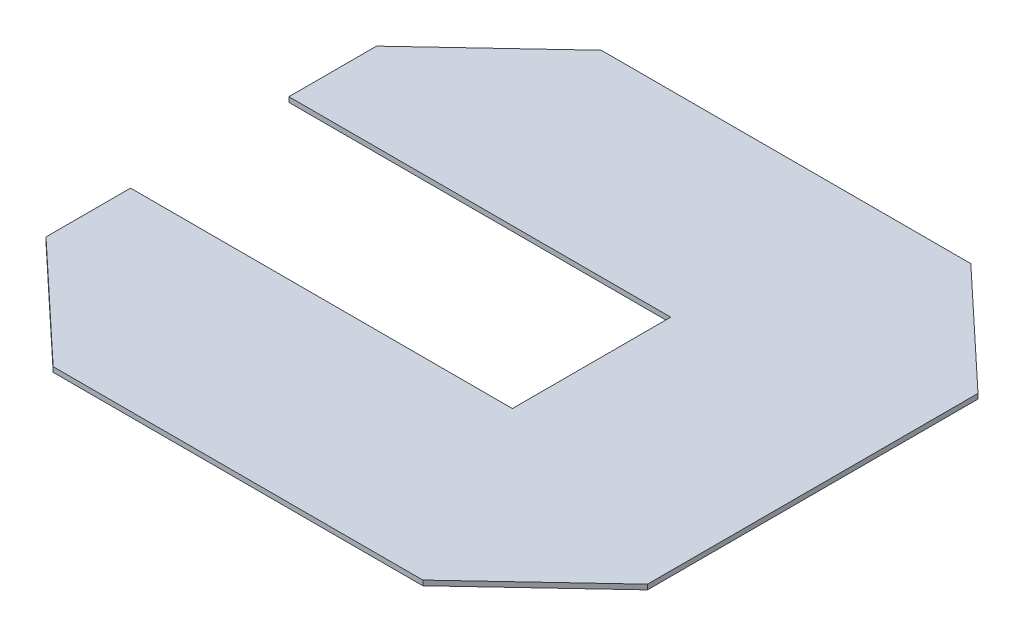
ISO-10303-21;
HEADER;
FILE_DESCRIPTION(('STEP AP214'),'2;1');
FILE_NAME('part.step','',(''),(''),'','','');
FILE_SCHEMA(('AUTOMOTIVE_DESIGN { 1 0 10303 214 1 1 1 1 }'));
ENDSEC;
DATA;
#1=APPLICATION_CONTEXT('core data for automotive mechanical design processes');
#2=APPLICATION_PROTOCOL_DEFINITION('international standard','automotive_design',2000,#1);
#3=PRODUCT_CONTEXT('',#1,'mechanical');
#4=PRODUCT('Part','Part','',(#3));
#5=PRODUCT_RELATED_PRODUCT_CATEGORY('part','',(#4));
#6=PRODUCT_DEFINITION_FORMATION('','',#4);
#7=PRODUCT_DEFINITION_CONTEXT('part definition',#1,'design');
#8=PRODUCT_DEFINITION('design','',#6,#7);
#9=PRODUCT_DEFINITION_SHAPE('','',#8);
#10=(LENGTH_UNIT() NAMED_UNIT(*) SI_UNIT(.MILLI.,.METRE.));
#11=(NAMED_UNIT(*) PLANE_ANGLE_UNIT() SI_UNIT($,.RADIAN.));
#12=(NAMED_UNIT(*) SI_UNIT($,.STERADIAN.) SOLID_ANGLE_UNIT());
#13=UNCERTAINTY_MEASURE_WITH_UNIT(LENGTH_MEASURE(1.E-05),#10,'distance_accuracy_value','');
#14=(GEOMETRIC_REPRESENTATION_CONTEXT(3) GLOBAL_UNCERTAINTY_ASSIGNED_CONTEXT((#13)) GLOBAL_UNIT_ASSIGNED_CONTEXT((#10,
#11,#12)) REPRESENTATION_CONTEXT('',''));
#15=CARTESIAN_POINT('',(0.,0.,0.));
#16=DIRECTION('',(0.,0.,1.));
#17=DIRECTION('',(1.,0.,0.));
#18=AXIS2_PLACEMENT_3D('',#15,#16,#17);
#19=CARTESIAN_POINT('',(151.062501167287,2.5,-84.3656451515783));
#20=DIRECTION('',(-1.,0.,0.));
#21=DIRECTION('',(0.,0.,1.));
#22=AXIS2_PLACEMENT_3D('',#19,#20,#21);
#23=PLANE('',#22);
#24=DIRECTION('',(0.,0.,-1.));
#25=VECTOR('',#24,1.);
#26=CARTESIAN_POINT('',(151.062501167287,0.,-84.3656451515783));
#27=LINE('',#26,#25);
#28=CARTESIAN_POINT('',(151.062501167287,0.,82.7522675664535));
#29=VERTEX_POINT('',#28);
#30=CARTESIAN_POINT('',(151.062501167287,0.,-84.3656451515783));
#31=VERTEX_POINT('',#30);
#32=EDGE_CURVE('E151',#29,#31,#27,.T.);
#33=ORIENTED_EDGE('',*,*,#32,.T.);
#34=DIRECTION('',(0.,-1.,0.));
#35=VECTOR('',#34,1.);
#36=CARTESIAN_POINT('',(151.062501167287,2.5,-84.3656451515783));
#37=LINE('',#36,#35);
#38=CARTESIAN_POINT('',(151.062501167287,2.5,-84.3656451515783));
#39=VERTEX_POINT('',#38);
#40=EDGE_CURVE('E11',#39,#31,#37,.T.);
#41=ORIENTED_EDGE('',*,*,#40,.F.);
#42=DIRECTION('',(0.,0.,-1.));
#43=VECTOR('',#42,1.);
#44=CARTESIAN_POINT('',(151.062501167287,2.5,-84.3656451515783));
#45=LINE('',#44,#43);
#46=CARTESIAN_POINT('',(151.062501167287,2.5,82.7522675664535));
#47=VERTEX_POINT('',#46);
#48=EDGE_CURVE('E173',#47,#39,#45,.T.);
#49=ORIENTED_EDGE('',*,*,#48,.F.);
#50=DIRECTION('',(0.,-1.,0.));
#51=VECTOR('',#50,1.);
#52=CARTESIAN_POINT('',(151.062501167287,2.5,82.7522675664535));
#53=LINE('',#52,#51);
#54=EDGE_CURVE('E147',#47,#29,#53,.T.);
#55=ORIENTED_EDGE('',*,*,#54,.T.);
#56=EDGE_LOOP('',(#33,#41,#49,#55));
#57=FACE_BOUND('',#56,.T.);
#58=ADVANCED_FACE('F31',(#57),#23,.F.);
#59=CARTESIAN_POINT('',(151.062501167287,2.5,-84.3656451515783));
#60=DIRECTION('',(-0.684162569970035,0.,0.729329539955703));
#61=DIRECTION('',(0.729329539955703,0.,0.684162569970035));
#62=AXIS2_PLACEMENT_3D('',#59,#60,#61);
#63=PLANE('',#62);
#64=DIRECTION('',(-0.729329539955703,0.,-0.684162569970035));
#65=VECTOR('',#64,1.);
#66=CARTESIAN_POINT('',(151.062501167287,0.,-84.3656451515783));
#67=LINE('',#66,#65);
#68=CARTESIAN_POINT('',(92.4315171610729,0.,-139.365645151578));
#69=VERTEX_POINT('',#68);
#70=EDGE_CURVE('E154',#31,#69,#67,.T.);
#71=ORIENTED_EDGE('',*,*,#70,.T.);
#72=DIRECTION('',(0.,-1.,0.));
#73=VECTOR('',#72,1.);
#74=CARTESIAN_POINT('',(92.4315171610729,2.5,-139.365645151578));
#75=LINE('',#74,#73);
#76=CARTESIAN_POINT('',(92.4315171610729,2.5,-139.365645151578));
#77=VERTEX_POINT('',#76);
#78=EDGE_CURVE('E39',#77,#69,#75,.T.);
#79=ORIENTED_EDGE('',*,*,#78,.F.);
#80=DIRECTION('',(-0.729329539955703,0.,-0.684162569970035));
#81=VECTOR('',#80,1.);
#82=CARTESIAN_POINT('',(151.062501167287,2.5,-84.3656451515783));
#83=LINE('',#82,#81);
#84=EDGE_CURVE('E102',#39,#77,#83,.T.);
#85=ORIENTED_EDGE('',*,*,#84,.F.);
#86=ORIENTED_EDGE('',*,*,#40,.T.);
#87=EDGE_LOOP('',(#71,#79,#85,#86));
#88=FACE_BOUND('',#87,.T.);
#89=ADVANCED_FACE('F251',(#88),#63,.F.);
#90=CARTESIAN_POINT('',(-94.4415080405909,2.5,-139.365645151578));
#91=DIRECTION('',(0.,0.,1.));
#92=DIRECTION('',(1.,0.,0.));
#93=AXIS2_PLACEMENT_3D('',#90,#91,#92);
#94=PLANE('',#93);
#95=DIRECTION('',(-1.,0.,0.));
#96=VECTOR('',#95,1.);
#97=CARTESIAN_POINT('',(-94.4415080405909,0.,-139.365645151578));
#98=LINE('',#97,#96);
#99=CARTESIAN_POINT('',(-94.4415080405909,0.,-139.365645151578));
#100=VERTEX_POINT('',#99);
#101=EDGE_CURVE('E156',#69,#100,#98,.T.);
#102=ORIENTED_EDGE('',*,*,#101,.T.);
#103=DIRECTION('',(0.,-1.,0.));
#104=VECTOR('',#103,1.);
#105=CARTESIAN_POINT('',(-94.4415080405909,2.5,-139.365645151578));
#106=LINE('',#105,#104);
#107=CARTESIAN_POINT('',(-94.4415080405909,2.5,-139.365645151578));
#108=VERTEX_POINT('',#107);
#109=EDGE_CURVE('E192',#108,#100,#106,.T.);
#110=ORIENTED_EDGE('',*,*,#109,.F.);
#111=DIRECTION('',(-1.,0.,0.));
#112=VECTOR('',#111,1.);
#113=CARTESIAN_POINT('',(-94.4415080405909,2.5,-139.365645151578));
#114=LINE('',#113,#112);
#115=EDGE_CURVE('E200',#77,#108,#114,.T.);
#116=ORIENTED_EDGE('',*,*,#115,.F.);
#117=ORIENTED_EDGE('',*,*,#78,.T.);
#118=EDGE_LOOP('',(#102,#110,#116,#117));
#119=FACE_BOUND('',#118,.T.);
#120=ADVANCED_FACE('F198',(#119),#94,.F.);
#121=CARTESIAN_POINT('',(-153.072492046805,2.5,-84.3656451515783));
#122=DIRECTION('',(0.684162569970035,0.,0.729329539955703));
#123=DIRECTION('',(0.729329539955703,0.,-0.684162569970035));
#124=AXIS2_PLACEMENT_3D('',#121,#122,#123);
#125=PLANE('',#124);
#126=DIRECTION('',(-0.729329539955703,0.,0.684162569970035));
#127=VECTOR('',#126,1.);
#128=CARTESIAN_POINT('',(-153.072492046805,0.,-84.3656451515783));
#129=LINE('',#128,#127);
#130=CARTESIAN_POINT('',(-153.072492046805,0.,-84.3656451515783));
#131=VERTEX_POINT('',#130);
#132=EDGE_CURVE('E158',#100,#131,#129,.T.);
#133=ORIENTED_EDGE('',*,*,#132,.T.);
#134=DIRECTION('',(0.,-1.,0.));
#135=VECTOR('',#134,1.);
#136=CARTESIAN_POINT('',(-153.072492046805,2.5,-84.3656451515783));
#137=LINE('',#136,#135);
#138=CARTESIAN_POINT('',(-153.072492046805,2.5,-84.3656451515783));
#139=VERTEX_POINT('',#138);
#140=EDGE_CURVE('E189',#139,#131,#137,.T.);
#141=ORIENTED_EDGE('',*,*,#140,.F.);
#142=DIRECTION('',(-0.729329539955703,0.,0.684162569970035));
#143=VECTOR('',#142,1.);
#144=CARTESIAN_POINT('',(-153.072492046805,2.5,-84.3656451515783));
#145=LINE('',#144,#143);
#146=EDGE_CURVE('E218',#108,#139,#145,.T.);
#147=ORIENTED_EDGE('',*,*,#146,.F.);
#148=ORIENTED_EDGE('',*,*,#109,.T.);
#149=EDGE_LOOP('',(#133,#141,#147,#148));
#150=FACE_BOUND('',#149,.T.);
#151=ADVANCED_FACE('F209',(#150),#125,.F.);
#152=CARTESIAN_POINT('',(-153.072492046805,2.5,-84.3656451515783));
#153=DIRECTION('',(1.,0.,0.));
#154=DIRECTION('',(0.,0.,-1.));
#155=AXIS2_PLACEMENT_3D('',#152,#153,#154);
#156=PLANE('',#155);
#157=DIRECTION('',(0.,0.,1.));
#158=VECTOR('',#157,1.);
#159=CARTESIAN_POINT('',(-153.072492046805,0.,-84.3656451515783));
#160=LINE('',#159,#158);
#161=CARTESIAN_POINT('',(-153.072492046805,0.,-40.0618137816611));
#162=VERTEX_POINT('',#161);
#163=EDGE_CURVE('E160',#131,#162,#160,.T.);
#164=ORIENTED_EDGE('',*,*,#163,.T.);
#165=DIRECTION('',(0.,-1.,0.));
#166=VECTOR('',#165,1.);
#167=CARTESIAN_POINT('',(-153.072492046805,2.5,-40.0618137816611));
#168=LINE('',#167,#166);
#169=CARTESIAN_POINT('',(-153.072492046805,2.5,-40.0618137816611));
#170=VERTEX_POINT('',#169);
#171=EDGE_CURVE('E186',#170,#162,#168,.T.);
#172=ORIENTED_EDGE('',*,*,#171,.F.);
#173=DIRECTION('',(0.,0.,1.));
#174=VECTOR('',#173,1.);
#175=CARTESIAN_POINT('',(-153.072492046805,2.5,-84.3656451515783));
#176=LINE('',#175,#174);
#177=EDGE_CURVE('E215',#139,#170,#176,.T.);
#178=ORIENTED_EDGE('',*,*,#177,.F.);
#179=ORIENTED_EDGE('',*,*,#140,.T.);
#180=EDGE_LOOP('',(#164,#172,#178,#179));
#181=FACE_BOUND('',#180,.T.);
#182=ADVANCED_FACE('F213',(#181),#156,.F.);
#183=CARTESIAN_POINT('',(-153.072492046805,2.5,-40.0618137816611));
#184=DIRECTION('',(0.,0.,-1.));
#185=DIRECTION('',(-1.,0.,0.));
#186=AXIS2_PLACEMENT_3D('',#183,#184,#185);
#187=PLANE('',#186);
#188=DIRECTION('',(1.,0.,0.));
#189=VECTOR('',#188,1.);
#190=CARTESIAN_POINT('',(-153.072492046805,0.,-40.0618137816611));
#191=LINE('',#190,#189);
#192=CARTESIAN_POINT('',(40.,0.,-40.0618137816611));
#193=VERTEX_POINT('',#192);
#194=EDGE_CURVE('E162',#162,#193,#191,.T.);
#195=ORIENTED_EDGE('',*,*,#194,.T.);
#196=DIRECTION('',(0.,-1.,0.));
#197=VECTOR('',#196,1.);
#198=CARTESIAN_POINT('',(40.,2.5,-40.0618137816611));
#199=LINE('',#198,#197);
#200=CARTESIAN_POINT('',(40.,2.5,-40.0618137816611));
#201=VERTEX_POINT('',#200);
#202=EDGE_CURVE('E183',#201,#193,#199,.T.);
#203=ORIENTED_EDGE('',*,*,#202,.F.);
#204=DIRECTION('',(1.,0.,0.));
#205=VECTOR('',#204,1.);
#206=CARTESIAN_POINT('',(-153.072492046805,2.5,-40.0618137816611));
#207=LINE('',#206,#205);
#208=EDGE_CURVE('E217',#170,#201,#207,.T.);
#209=ORIENTED_EDGE('',*,*,#208,.F.);
#210=ORIENTED_EDGE('',*,*,#171,.T.);
#211=EDGE_LOOP('',(#195,#203,#209,#210));
#212=FACE_BOUND('',#211,.T.);
#213=ADVANCED_FACE('F264',(#212),#187,.F.);
#214=CARTESIAN_POINT('',(40.,2.5,-40.0618137816611));
#215=DIRECTION('',(1.,0.,0.));
#216=DIRECTION('',(0.,0.,-1.));
#217=AXIS2_PLACEMENT_3D('',#214,#215,#216);
#218=PLANE('',#217);
#219=DIRECTION('',(0.,0.,1.));
#220=VECTOR('',#219,1.);
#221=CARTESIAN_POINT('',(40.,0.,-40.0618137816611));
#222=LINE('',#221,#220);
#223=CARTESIAN_POINT('',(40.,0.,40.));
#224=VERTEX_POINT('',#223);
#225=EDGE_CURVE('E164',#193,#224,#222,.T.);
#226=ORIENTED_EDGE('',*,*,#225,.T.);
#227=DIRECTION('',(0.,-1.,0.));
#228=VECTOR('',#227,1.);
#229=CARTESIAN_POINT('',(40.,2.5,40.));
#230=LINE('',#229,#228);
#231=CARTESIAN_POINT('',(40.,2.5,40.));
#232=VERTEX_POINT('',#231);
#233=EDGE_CURVE('E180',#232,#224,#230,.T.);
#234=ORIENTED_EDGE('',*,*,#233,.F.);
#235=DIRECTION('',(0.,0.,1.));
#236=VECTOR('',#235,1.);
#237=CARTESIAN_POINT('',(40.,2.5,-40.0618137816611));
#238=LINE('',#237,#236);
#239=EDGE_CURVE('E220',#201,#232,#238,.T.);
#240=ORIENTED_EDGE('',*,*,#239,.F.);
#241=ORIENTED_EDGE('',*,*,#202,.T.);
#242=EDGE_LOOP('',(#226,#234,#240,#241));
#243=FACE_BOUND('',#242,.T.);
#244=ADVANCED_FACE('F267',(#243),#218,.F.);
#245=CARTESIAN_POINT('',(-153.072492046805,2.5,40.));
#246=DIRECTION('',(0.,0.,1.));
#247=DIRECTION('',(1.,0.,0.));
#248=AXIS2_PLACEMENT_3D('',#245,#246,#247);
#249=PLANE('',#248);
#250=DIRECTION('',(-1.,0.,0.));
#251=VECTOR('',#250,1.);
#252=CARTESIAN_POINT('',(-153.072492046805,0.,40.));
#253=LINE('',#252,#251);
#254=CARTESIAN_POINT('',(-153.072492046805,0.,40.));
#255=VERTEX_POINT('',#254);
#256=EDGE_CURVE('E166',#224,#255,#253,.T.);
#257=ORIENTED_EDGE('',*,*,#256,.T.);
#258=DIRECTION('',(0.,-1.,0.));
#259=VECTOR('',#258,1.);
#260=CARTESIAN_POINT('',(-153.072492046805,2.5,40.));
#261=LINE('',#260,#259);
#262=CARTESIAN_POINT('',(-153.072492046805,2.5,40.));
#263=VERTEX_POINT('',#262);
#264=EDGE_CURVE('E177',#263,#255,#261,.T.);
#265=ORIENTED_EDGE('',*,*,#264,.F.);
#266=DIRECTION('',(-1.,0.,0.));
#267=VECTOR('',#266,1.);
#268=CARTESIAN_POINT('',(-153.072492046805,2.5,40.));
#269=LINE('',#268,#267);
#270=EDGE_CURVE('E226',#232,#263,#269,.T.);
#271=ORIENTED_EDGE('',*,*,#270,.F.);
#272=ORIENTED_EDGE('',*,*,#233,.T.);
#273=EDGE_LOOP('',(#257,#265,#271,#272));
#274=FACE_BOUND('',#273,.T.);
#275=ADVANCED_FACE('F232',(#274),#249,.F.);
#276=CARTESIAN_POINT('',(-153.072492046805,2.5,40.));
#277=DIRECTION('',(1.,0.,0.));
#278=DIRECTION('',(0.,0.,-1.));
#279=AXIS2_PLACEMENT_3D('',#276,#277,#278);
#280=PLANE('',#279);
#281=DIRECTION('',(0.,0.,1.));
#282=VECTOR('',#281,1.);
#283=CARTESIAN_POINT('',(-153.072492046805,0.,40.));
#284=LINE('',#283,#282);
#285=CARTESIAN_POINT('',(-153.072492046805,0.,82.7522675664535));
#286=VERTEX_POINT('',#285);
#287=EDGE_CURVE('E168',#255,#286,#284,.T.);
#288=ORIENTED_EDGE('',*,*,#287,.T.);
#289=DIRECTION('',(0.,-1.,0.));
#290=VECTOR('',#289,1.);
#291=CARTESIAN_POINT('',(-153.072492046805,2.5,82.7522675664535));
#292=LINE('',#291,#290);
#293=CARTESIAN_POINT('',(-153.072492046805,2.5,82.7522675664535));
#294=VERTEX_POINT('',#293);
#295=EDGE_CURVE('E142',#294,#286,#292,.T.);
#296=ORIENTED_EDGE('',*,*,#295,.F.);
#297=DIRECTION('',(0.,0.,1.));
#298=VECTOR('',#297,1.);
#299=CARTESIAN_POINT('',(-153.072492046805,2.5,40.));
#300=LINE('',#299,#298);
#301=EDGE_CURVE('E133',#263,#294,#300,.T.);
#302=ORIENTED_EDGE('',*,*,#301,.F.);
#303=ORIENTED_EDGE('',*,*,#264,.T.);
#304=EDGE_LOOP('',(#288,#296,#302,#303));
#305=FACE_BOUND('',#304,.T.);
#306=ADVANCED_FACE('F236',(#305),#280,.F.);
#307=CARTESIAN_POINT('',(-94.4415080405909,2.5,137.752267566454));
#308=DIRECTION('',(0.684162569970035,0.,-0.729329539955703));
#309=DIRECTION('',(-0.729329539955703,0.,-0.684162569970035));
#310=AXIS2_PLACEMENT_3D('',#307,#308,#309);
#311=PLANE('',#310);
#312=DIRECTION('',(0.729329539955703,0.,0.684162569970035));
#313=VECTOR('',#312,1.);
#314=CARTESIAN_POINT('',(-94.4415080405909,0.,137.752267566454));
#315=LINE('',#314,#313);
#316=CARTESIAN_POINT('',(-94.4415080405909,0.,137.752267566454));
#317=VERTEX_POINT('',#316);
#318=EDGE_CURVE('E141',#286,#317,#315,.T.);
#319=ORIENTED_EDGE('',*,*,#318,.T.);
#320=DIRECTION('',(0.,-1.,0.));
#321=VECTOR('',#320,1.);
#322=CARTESIAN_POINT('',(-94.4415080405909,2.5,137.752267566454));
#323=LINE('',#322,#321);
#324=CARTESIAN_POINT('',(-94.4415080405909,2.5,137.752267566454));
#325=VERTEX_POINT('',#324);
#326=EDGE_CURVE('E138',#325,#317,#323,.T.);
#327=ORIENTED_EDGE('',*,*,#326,.F.);
#328=DIRECTION('',(0.729329539955703,0.,0.684162569970035));
#329=VECTOR('',#328,1.);
#330=CARTESIAN_POINT('',(-94.4415080405909,2.5,137.752267566454));
#331=LINE('',#330,#329);
#332=EDGE_CURVE('E127',#294,#325,#331,.T.);
#333=ORIENTED_EDGE('',*,*,#332,.F.);
#334=ORIENTED_EDGE('',*,*,#295,.T.);
#335=EDGE_LOOP('',(#319,#327,#333,#334));
#336=FACE_BOUND('',#335,.T.);
#337=ADVANCED_FACE('F139',(#336),#311,.F.);
#338=CARTESIAN_POINT('',(-94.4415080405909,2.5,137.752267566454));
#339=DIRECTION('',(0.,0.,-1.));
#340=DIRECTION('',(-1.,0.,0.));
#341=AXIS2_PLACEMENT_3D('',#338,#339,#340);
#342=PLANE('',#341);
#343=DIRECTION('',(1.,0.,0.));
#344=VECTOR('',#343,1.);
#345=CARTESIAN_POINT('',(-94.4415080405909,0.,137.752267566454));
#346=LINE('',#345,#344);
#347=CARTESIAN_POINT('',(92.4315171610729,0.,137.752267566454));
#348=VERTEX_POINT('',#347);
#349=EDGE_CURVE('E88',#317,#348,#346,.T.);
#350=ORIENTED_EDGE('',*,*,#349,.T.);
#351=DIRECTION('',(0.,-1.,0.));
#352=VECTOR('',#351,1.);
#353=CARTESIAN_POINT('',(92.4315171610729,2.5,137.752267566454));
#354=LINE('',#353,#352);
#355=CARTESIAN_POINT('',(92.4315171610729,2.5,137.752267566454));
#356=VERTEX_POINT('',#355);
#357=EDGE_CURVE('E143',#356,#348,#354,.T.);
#358=ORIENTED_EDGE('',*,*,#357,.F.);
#359=DIRECTION('',(1.,0.,0.));
#360=VECTOR('',#359,1.);
#361=CARTESIAN_POINT('',(-94.4415080405909,2.5,137.752267566454));
#362=LINE('',#361,#360);
#363=EDGE_CURVE('E131',#325,#356,#362,.T.);
#364=ORIENTED_EDGE('',*,*,#363,.F.);
#365=ORIENTED_EDGE('',*,*,#326,.T.);
#366=EDGE_LOOP('',(#350,#358,#364,#365));
#367=FACE_BOUND('',#366,.T.);
#368=ADVANCED_FACE('F145',(#367),#342,.F.);
#369=CARTESIAN_POINT('',(92.4315171610729,2.5,137.752267566454));
#370=DIRECTION('',(-0.684162569970035,0.,-0.729329539955703));
#371=DIRECTION('',(-0.729329539955703,0.,0.684162569970035));
#372=AXIS2_PLACEMENT_3D('',#369,#370,#371);
#373=PLANE('',#372);
#374=DIRECTION('',(0.729329539955703,0.,-0.684162569970035));
#375=VECTOR('',#374,1.);
#376=CARTESIAN_POINT('',(92.4315171610729,0.,137.752267566454));
#377=LINE('',#376,#375);
#378=EDGE_CURVE('E94',#348,#29,#377,.T.);
#379=ORIENTED_EDGE('',*,*,#378,.T.);
#380=ORIENTED_EDGE('',*,*,#54,.F.);
#381=DIRECTION('',(0.729329539955703,0.,-0.684162569970035));
#382=VECTOR('',#381,1.);
#383=CARTESIAN_POINT('',(92.4315171610729,2.5,137.752267566454));
#384=LINE('',#383,#382);
#385=EDGE_CURVE('E47',#356,#47,#384,.T.);
#386=ORIENTED_EDGE('',*,*,#385,.F.);
#387=ORIENTED_EDGE('',*,*,#357,.T.);
#388=EDGE_LOOP('',(#379,#380,#386,#387));
#389=FACE_BOUND('',#388,.T.);
#390=ADVANCED_FACE('F240',(#389),#373,.F.);
#391=CARTESIAN_POINT('',(151.062501167287,2.5,137.752267566454));
#392=DIRECTION('',(0.,1.,0.));
#393=DIRECTION('',(0.,0.,1.));
#394=AXIS2_PLACEMENT_3D('',#391,#392,#393);
#395=PLANE('',#394);
#396=ORIENTED_EDGE('',*,*,#48,.T.);
#397=ORIENTED_EDGE('',*,*,#84,.T.);
#398=ORIENTED_EDGE('',*,*,#115,.T.);
#399=ORIENTED_EDGE('',*,*,#146,.T.);
#400=ORIENTED_EDGE('',*,*,#177,.T.);
#401=ORIENTED_EDGE('',*,*,#208,.T.);
#402=ORIENTED_EDGE('',*,*,#239,.T.);
#403=ORIENTED_EDGE('',*,*,#270,.T.);
#404=ORIENTED_EDGE('',*,*,#301,.T.);
#405=ORIENTED_EDGE('',*,*,#332,.T.);
#406=ORIENTED_EDGE('',*,*,#363,.T.);
#407=ORIENTED_EDGE('',*,*,#385,.T.);
#408=EDGE_LOOP('',(#396,#397,#398,#399,#400,#401,#402,#403,#404,#405,#406,#407));
#409=FACE_BOUND('',#408,.T.);
#410=ADVANCED_FACE('F129',(#409),#395,.T.);
#411=CARTESIAN_POINT('',(151.062501167287,0.,137.752267566454));
#412=DIRECTION('',(0.,1.,0.));
#413=DIRECTION('',(0.,0.,1.));
#414=AXIS2_PLACEMENT_3D('',#411,#412,#413);
#415=PLANE('',#414);
#416=ORIENTED_EDGE('',*,*,#32,.F.);
#417=ORIENTED_EDGE('',*,*,#378,.F.);
#418=ORIENTED_EDGE('',*,*,#349,.F.);
#419=ORIENTED_EDGE('',*,*,#318,.F.);
#420=ORIENTED_EDGE('',*,*,#287,.F.);
#421=ORIENTED_EDGE('',*,*,#256,.F.);
#422=ORIENTED_EDGE('',*,*,#225,.F.);
#423=ORIENTED_EDGE('',*,*,#194,.F.);
#424=ORIENTED_EDGE('',*,*,#163,.F.);
#425=ORIENTED_EDGE('',*,*,#132,.F.);
#426=ORIENTED_EDGE('',*,*,#101,.F.);
#427=ORIENTED_EDGE('',*,*,#70,.F.);
#428=EDGE_LOOP('',(#416,#417,#418,#419,#420,#421,#422,#423,#424,#425,#426,#427));
#429=FACE_BOUND('',#428,.T.);
#430=ADVANCED_FACE('F204',(#429),#415,.F.);
#431=CLOSED_SHELL('',(#58,#89,#120,#151,#182,#213,#244,#275,#306,#337,#368,#390,#410,#430));
#432=MANIFOLD_SOLID_BREP('B2',#431);
#433=ADVANCED_BREP_SHAPE_REPRESENTATION('',(#18,#432),#14);
#434=SHAPE_DEFINITION_REPRESENTATION(#9,#433);
ENDSEC;
END-ISO-10303-21;
